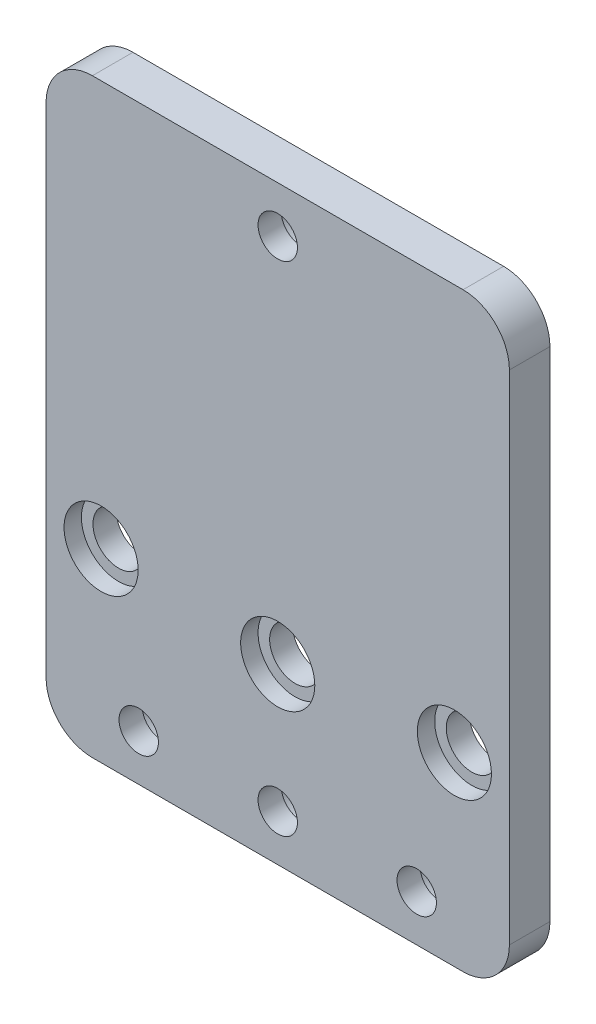
ISO-10303-21;
HEADER;
FILE_DESCRIPTION(('STEP AP214'),'2;1');
FILE_NAME('part.step','',(''),(''),'','','');
FILE_SCHEMA(('AUTOMOTIVE_DESIGN { 1 0 10303 214 1 1 1 1 }'));
ENDSEC;
DATA;
#1=APPLICATION_CONTEXT('core data for automotive mechanical design processes');
#2=APPLICATION_PROTOCOL_DEFINITION('international standard','automotive_design',2000,#1);
#3=PRODUCT_CONTEXT('',#1,'mechanical');
#4=PRODUCT('Part','Part','',(#3));
#5=PRODUCT_RELATED_PRODUCT_CATEGORY('part','',(#4));
#6=PRODUCT_DEFINITION_FORMATION('','',#4);
#7=PRODUCT_DEFINITION_CONTEXT('part definition',#1,'design');
#8=PRODUCT_DEFINITION('design','',#6,#7);
#9=PRODUCT_DEFINITION_SHAPE('','',#8);
#10=(LENGTH_UNIT() NAMED_UNIT(*) SI_UNIT(.MILLI.,.METRE.));
#11=(NAMED_UNIT(*) PLANE_ANGLE_UNIT() SI_UNIT($,.RADIAN.));
#12=(NAMED_UNIT(*) SI_UNIT($,.STERADIAN.) SOLID_ANGLE_UNIT());
#13=UNCERTAINTY_MEASURE_WITH_UNIT(LENGTH_MEASURE(1.E-05),#10,'distance_accuracy_value','');
#14=(GEOMETRIC_REPRESENTATION_CONTEXT(3) GLOBAL_UNCERTAINTY_ASSIGNED_CONTEXT((#13)) GLOBAL_UNIT_ASSIGNED_CONTEXT((#10,
#11,#12)) REPRESENTATION_CONTEXT('',''));
#15=CARTESIAN_POINT('',(0.,0.,0.));
#16=DIRECTION('',(0.,0.,1.));
#17=DIRECTION('',(1.,0.,0.));
#18=AXIS2_PLACEMENT_3D('',#15,#16,#17);
#19=CARTESIAN_POINT('',(8236.96943647304,3040.35410162317,3.5));
#20=DIRECTION('',(0.,0.,-1.));
#21=DIRECTION('',(-1.,0.,0.));
#22=AXIS2_PLACEMENT_3D('',#19,#20,#21);
#23=CYLINDRICAL_SURFACE('',#22,1.69999999999968);
#24=CARTESIAN_POINT('',(8236.96943647304,3040.35410162317,3.5));
#25=DIRECTION('',(0.,0.,1.));
#26=DIRECTION('',(1.,0.,0.));
#27=AXIS2_PLACEMENT_3D('',#24,#25,#26);
#28=CIRCLE('',#27,1.69999999999968);
#29=CARTESIAN_POINT('',(8238.66943647304,3040.35410162317,3.5));
#30=VERTEX_POINT('',#29);
#31=EDGE_CURVE('E159',#30,#30,#28,.T.);
#32=ORIENTED_EDGE('',*,*,#31,.T.);
#33=EDGE_LOOP('',(#32));
#34=FACE_BOUND('',#33,.T.);
#35=CARTESIAN_POINT('',(8236.96943647304,3040.35410162317,1.5));
#36=DIRECTION('',(0.,0.,-1.));
#37=DIRECTION('',(-1.,0.,0.));
#38=AXIS2_PLACEMENT_3D('',#35,#36,#37);
#39=CIRCLE('',#38,1.69999999999968);
#40=CARTESIAN_POINT('',(8235.26943647304,3040.35410162317,1.5));
#41=VERTEX_POINT('',#40);
#42=EDGE_CURVE('E53',#41,#41,#39,.T.);
#43=ORIENTED_EDGE('',*,*,#42,.T.);
#44=EDGE_LOOP('',(#43));
#45=FACE_BOUND('',#44,.T.);
#46=ADVANCED_FACE('F49',(#34,#45),#23,.F.);
#47=CARTESIAN_POINT('',(8248.96943647229,2997.36627584749,3.5));
#48=DIRECTION('',(0.,0.,-1.));
#49=DIRECTION('',(-1.,0.,0.));
#50=AXIS2_PLACEMENT_3D('',#47,#48,#49);
#51=CYLINDRICAL_SURFACE('',#50,1.69999999999968);
#52=CARTESIAN_POINT('',(8248.96943647229,2997.36627584749,3.5));
#53=DIRECTION('',(0.,0.,1.));
#54=DIRECTION('',(1.,0.,0.));
#55=AXIS2_PLACEMENT_3D('',#52,#53,#54);
#56=CIRCLE('',#55,1.69999999999968);
#57=CARTESIAN_POINT('',(8250.66943647229,2997.36627584749,3.5));
#58=VERTEX_POINT('',#57);
#59=EDGE_CURVE('E250',#58,#58,#56,.T.);
#60=ORIENTED_EDGE('',*,*,#59,.T.);
#61=EDGE_LOOP('',(#60));
#62=FACE_BOUND('',#61,.T.);
#63=CARTESIAN_POINT('',(8248.96943647229,2997.36627584749,1.5));
#64=DIRECTION('',(0.,0.,-1.));
#65=DIRECTION('',(-1.,0.,0.));
#66=AXIS2_PLACEMENT_3D('',#63,#64,#65);
#67=CIRCLE('',#66,1.69999999999968);
#68=CARTESIAN_POINT('',(8247.26943647229,2997.36627584749,1.5));
#69=VERTEX_POINT('',#68);
#70=EDGE_CURVE('E215',#69,#69,#67,.T.);
#71=ORIENTED_EDGE('',*,*,#70,.T.);
#72=EDGE_LOOP('',(#71));
#73=FACE_BOUND('',#72,.T.);
#74=ADVANCED_FACE('F300',(#62,#73),#51,.F.);
#75=CARTESIAN_POINT('',(8236.96943647229,2997.36627584749,3.5));
#76=DIRECTION('',(0.,0.,-1.));
#77=DIRECTION('',(-1.,0.,0.));
#78=AXIS2_PLACEMENT_3D('',#75,#76,#77);
#79=CYLINDRICAL_SURFACE('',#78,1.69999999999968);
#80=CARTESIAN_POINT('',(8236.96943647229,2997.36627584749,3.5));
#81=DIRECTION('',(0.,0.,1.));
#82=DIRECTION('',(1.,0.,0.));
#83=AXIS2_PLACEMENT_3D('',#80,#81,#82);
#84=CIRCLE('',#83,1.69999999999968);
#85=CARTESIAN_POINT('',(8238.66943647229,2997.36627584749,3.5));
#86=VERTEX_POINT('',#85);
#87=EDGE_CURVE('E246',#86,#86,#84,.T.);
#88=ORIENTED_EDGE('',*,*,#87,.T.);
#89=EDGE_LOOP('',(#88));
#90=FACE_BOUND('',#89,.T.);
#91=CARTESIAN_POINT('',(8236.96943647229,2997.36627584749,1.5));
#92=DIRECTION('',(0.,0.,-1.));
#93=DIRECTION('',(-1.,0.,0.));
#94=AXIS2_PLACEMENT_3D('',#91,#92,#93);
#95=CIRCLE('',#94,1.69999999999968);
#96=CARTESIAN_POINT('',(8235.26943647229,2997.36627584749,1.5));
#97=VERTEX_POINT('',#96);
#98=EDGE_CURVE('E212',#97,#97,#95,.T.);
#99=ORIENTED_EDGE('',*,*,#98,.T.);
#100=EDGE_LOOP('',(#99));
#101=FACE_BOUND('',#100,.T.);
#102=ADVANCED_FACE('F305',(#90,#101),#79,.F.);
#103=CARTESIAN_POINT('',(8224.96943647229,2997.36627584749,3.5));
#104=DIRECTION('',(0.,0.,-1.));
#105=DIRECTION('',(-1.,0.,0.));
#106=AXIS2_PLACEMENT_3D('',#103,#104,#105);
#107=CYLINDRICAL_SURFACE('',#106,1.69999999999968);
#108=CARTESIAN_POINT('',(8224.96943647229,2997.36627584749,3.5));
#109=DIRECTION('',(0.,0.,1.));
#110=DIRECTION('',(1.,0.,0.));
#111=AXIS2_PLACEMENT_3D('',#108,#109,#110);
#112=CIRCLE('',#111,1.69999999999968);
#113=CARTESIAN_POINT('',(8226.66943647229,2997.36627584749,3.5));
#114=VERTEX_POINT('',#113);
#115=EDGE_CURVE('E242',#114,#114,#112,.T.);
#116=ORIENTED_EDGE('',*,*,#115,.T.);
#117=EDGE_LOOP('',(#116));
#118=FACE_BOUND('',#117,.T.);
#119=CARTESIAN_POINT('',(8224.96943647229,2997.36627584749,1.5));
#120=DIRECTION('',(0.,0.,-1.));
#121=DIRECTION('',(-1.,0.,0.));
#122=AXIS2_PLACEMENT_3D('',#119,#120,#121);
#123=CIRCLE('',#122,1.69999999999968);
#124=CARTESIAN_POINT('',(8223.26943647229,2997.36627584749,1.5));
#125=VERTEX_POINT('',#124);
#126=EDGE_CURVE('E208',#125,#125,#123,.T.);
#127=ORIENTED_EDGE('',*,*,#126,.T.);
#128=EDGE_LOOP('',(#127));
#129=FACE_BOUND('',#128,.T.);
#130=ADVANCED_FACE('F385',(#118,#129),#107,.F.);
#131=CARTESIAN_POINT('',(8236.96943647304,3008.36627584749,3.5));
#132=DIRECTION('',(0.,0.,-1.));
#133=DIRECTION('',(-1.,0.,0.));
#134=AXIS2_PLACEMENT_3D('',#131,#132,#133);
#135=CYLINDRICAL_SURFACE('',#134,2.19999999999973);
#136=CARTESIAN_POINT('',(8236.96943647304,3008.36627584749,0.));
#137=DIRECTION('',(0.,0.,1.));
#138=DIRECTION('',(1.,0.,0.));
#139=AXIS2_PLACEMENT_3D('',#136,#137,#138);
#140=CIRCLE('',#139,2.19999999999973);
#141=CARTESIAN_POINT('',(8239.16943647304,3008.36627584749,0.));
#142=VERTEX_POINT('',#141);
#143=EDGE_CURVE('E233',#142,#142,#140,.T.);
#144=ORIENTED_EDGE('',*,*,#143,.F.);
#145=EDGE_LOOP('',(#144));
#146=FACE_BOUND('',#145,.T.);
#147=CARTESIAN_POINT('',(8236.96943647304,3008.36627584749,2.));
#148=DIRECTION('',(0.,0.,1.));
#149=DIRECTION('',(1.,0.,0.));
#150=AXIS2_PLACEMENT_3D('',#147,#148,#149);
#151=CIRCLE('',#150,2.19999999999973);
#152=CARTESIAN_POINT('',(8239.16943647304,3008.36627584749,2.));
#153=VERTEX_POINT('',#152);
#154=EDGE_CURVE('E204',#153,#153,#151,.T.);
#155=ORIENTED_EDGE('',*,*,#154,.T.);
#156=EDGE_LOOP('',(#155));
#157=FACE_BOUND('',#156,.T.);
#158=ADVANCED_FACE('F388',(#146,#157),#135,.F.);
#159=CARTESIAN_POINT('',(8221.71943647304,3009.36627584749,3.5));
#160=DIRECTION('',(0.,0.,-1.));
#161=DIRECTION('',(-1.,0.,0.));
#162=AXIS2_PLACEMENT_3D('',#159,#160,#161);
#163=CYLINDRICAL_SURFACE('',#162,2.19999999999973);
#164=CARTESIAN_POINT('',(8221.71943647304,3009.36627584749,0.));
#165=DIRECTION('',(0.,0.,1.));
#166=DIRECTION('',(1.,0.,0.));
#167=AXIS2_PLACEMENT_3D('',#164,#165,#166);
#168=CIRCLE('',#167,2.19999999999973);
#169=CARTESIAN_POINT('',(8223.91943647304,3009.36627584749,0.));
#170=VERTEX_POINT('',#169);
#171=EDGE_CURVE('E227',#170,#170,#168,.T.);
#172=ORIENTED_EDGE('',*,*,#171,.F.);
#173=EDGE_LOOP('',(#172));
#174=FACE_BOUND('',#173,.T.);
#175=CARTESIAN_POINT('',(8221.71943647304,3009.36627584749,2.));
#176=DIRECTION('',(0.,0.,1.));
#177=DIRECTION('',(1.,0.,0.));
#178=AXIS2_PLACEMENT_3D('',#175,#176,#177);
#179=CIRCLE('',#178,2.19999999999973);
#180=CARTESIAN_POINT('',(8223.91943647304,3009.36627584749,2.));
#181=VERTEX_POINT('',#180);
#182=EDGE_CURVE('E199',#181,#181,#179,.T.);
#183=ORIENTED_EDGE('',*,*,#182,.T.);
#184=EDGE_LOOP('',(#183));
#185=FACE_BOUND('',#184,.T.);
#186=ADVANCED_FACE('F425',(#174,#185),#163,.F.);
#187=CARTESIAN_POINT('',(8252.21943647304,3009.36627584749,3.5));
#188=DIRECTION('',(0.,0.,-1.));
#189=DIRECTION('',(-1.,0.,0.));
#190=AXIS2_PLACEMENT_3D('',#187,#188,#189);
#191=CYLINDRICAL_SURFACE('',#190,2.19999999999973);
#192=CARTESIAN_POINT('',(8252.21943647304,3009.36627584749,0.));
#193=DIRECTION('',(0.,0.,1.));
#194=DIRECTION('',(1.,0.,0.));
#195=AXIS2_PLACEMENT_3D('',#192,#193,#194);
#196=CIRCLE('',#195,2.19999999999973);
#197=CARTESIAN_POINT('',(8254.41943647304,3009.36627584749,0.));
#198=VERTEX_POINT('',#197);
#199=EDGE_CURVE('E222',#198,#198,#196,.T.);
#200=ORIENTED_EDGE('',*,*,#199,.F.);
#201=EDGE_LOOP('',(#200));
#202=FACE_BOUND('',#201,.T.);
#203=CARTESIAN_POINT('',(8252.21943647304,3009.36627584749,2.));
#204=DIRECTION('',(0.,0.,1.));
#205=DIRECTION('',(1.,0.,0.));
#206=AXIS2_PLACEMENT_3D('',#203,#204,#205);
#207=CIRCLE('',#206,2.19999999999973);
#208=CARTESIAN_POINT('',(8254.41943647304,3009.36627584749,2.));
#209=VERTEX_POINT('',#208);
#210=EDGE_CURVE('E195',#209,#209,#207,.T.);
#211=ORIENTED_EDGE('',*,*,#210,.T.);
#212=EDGE_LOOP('',(#211));
#213=FACE_BOUND('',#212,.T.);
#214=ADVANCED_FACE('F311',(#202,#213),#191,.F.);
#215=CARTESIAN_POINT('',(8252.96943647229,2997.36627584749,3.5));
#216=DIRECTION('',(0.,0.,1.));
#217=DIRECTION('',(1.,0.,0.));
#218=AXIS2_PLACEMENT_3D('',#215,#216,#217);
#219=PLANE('',#218);
#220=CARTESIAN_POINT('',(8252.21943647304,3009.36627584749,3.5));
#221=DIRECTION('',(0.,0.,1.));
#222=DIRECTION('',(1.,0.,0.));
#223=AXIS2_PLACEMENT_3D('',#220,#221,#222);
#224=CIRCLE('',#223,3.19999999999985);
#225=CARTESIAN_POINT('',(8255.41943647304,3009.36627584749,3.5));
#226=VERTEX_POINT('',#225);
#227=EDGE_CURVE('E343',#226,#226,#224,.T.);
#228=ORIENTED_EDGE('',*,*,#227,.F.);
#229=EDGE_LOOP('',(#228));
#230=FACE_BOUND('',#229,.T.);
#231=CARTESIAN_POINT('',(8221.71943647304,3009.36627584749,3.5));
#232=DIRECTION('',(0.,0.,1.));
#233=DIRECTION('',(1.,0.,0.));
#234=AXIS2_PLACEMENT_3D('',#231,#232,#233);
#235=CIRCLE('',#234,3.19999999999985);
#236=CARTESIAN_POINT('',(8224.91943647304,3009.36627584749,3.5));
#237=VERTEX_POINT('',#236);
#238=EDGE_CURVE('E351',#237,#237,#235,.T.);
#239=ORIENTED_EDGE('',*,*,#238,.F.);
#240=EDGE_LOOP('',(#239));
#241=FACE_BOUND('',#240,.T.);
#242=CARTESIAN_POINT('',(8236.96943647304,3008.36627584749,3.5));
#243=DIRECTION('',(0.,0.,1.));
#244=DIRECTION('',(1.,0.,0.));
#245=AXIS2_PLACEMENT_3D('',#242,#243,#244);
#246=CIRCLE('',#245,3.19999999999985);
#247=CARTESIAN_POINT('',(8240.16943647304,3008.36627584749,3.5));
#248=VERTEX_POINT('',#247);
#249=EDGE_CURVE('E236',#248,#248,#246,.T.);
#250=ORIENTED_EDGE('',*,*,#249,.F.);
#251=EDGE_LOOP('',(#250));
#252=FACE_BOUND('',#251,.T.);
#253=ORIENTED_EDGE('',*,*,#115,.F.);
#254=EDGE_LOOP('',(#253));
#255=FACE_BOUND('',#254,.T.);
#256=ORIENTED_EDGE('',*,*,#59,.F.);
#257=EDGE_LOOP('',(#256));
#258=FACE_BOUND('',#257,.T.);
#259=CARTESIAN_POINT('',(8252.96943647229,2997.36627584749,3.5));
#260=DIRECTION('',(0.,0.,1.));
#261=DIRECTION('',(1.,0.,0.));
#262=AXIS2_PLACEMENT_3D('',#259,#260,#261);
#263=CIRCLE('',#262,3.99999999999978);
#264=CARTESIAN_POINT('',(8252.96943647229,2993.36627584749,3.5));
#265=VERTEX_POINT('',#264);
#266=CARTESIAN_POINT('',(8256.96943647229,2997.36627584749,3.5));
#267=VERTEX_POINT('',#266);
#268=EDGE_CURVE('E177',#265,#267,#263,.T.);
#269=ORIENTED_EDGE('',*,*,#268,.T.);
#270=DIRECTION('',(0.,1.,0.));
#271=VECTOR('',#270,1.);
#272=CARTESIAN_POINT('',(8256.96943647229,3040.35410162317,3.5));
#273=LINE('',#272,#271);
#274=CARTESIAN_POINT('',(8256.96943647229,3040.35410162317,3.5));
#275=VERTEX_POINT('',#274);
#276=EDGE_CURVE('E112',#267,#275,#273,.T.);
#277=ORIENTED_EDGE('',*,*,#276,.T.);
#278=CARTESIAN_POINT('',(8252.96943647229,3040.35410162317,3.5));
#279=DIRECTION('',(0.,0.,1.));
#280=DIRECTION('',(-1.,0.,0.));
#281=AXIS2_PLACEMENT_3D('',#278,#279,#280);
#282=CIRCLE('',#281,3.99999999999978);
#283=CARTESIAN_POINT('',(8252.96943647229,3044.35410162317,3.5));
#284=VERTEX_POINT('',#283);
#285=EDGE_CURVE('E261',#275,#284,#282,.T.);
#286=ORIENTED_EDGE('',*,*,#285,.T.);
#287=DIRECTION('',(-1.,0.,0.));
#288=VECTOR('',#287,1.);
#289=CARTESIAN_POINT('',(8220.96943647229,3044.35410162317,3.5));
#290=LINE('',#289,#288);
#291=CARTESIAN_POINT('',(8220.96943647229,3044.35410162317,3.5));
#292=VERTEX_POINT('',#291);
#293=EDGE_CURVE('E264',#284,#292,#290,.T.);
#294=ORIENTED_EDGE('',*,*,#293,.T.);
#295=CARTESIAN_POINT('',(8220.96943647229,3040.35410162317,3.5));
#296=DIRECTION('',(0.,0.,1.));
#297=DIRECTION('',(1.,0.,0.));
#298=AXIS2_PLACEMENT_3D('',#295,#296,#297);
#299=CIRCLE('',#298,3.99999999999978);
#300=CARTESIAN_POINT('',(8216.96943647229,3040.35410162317,3.5));
#301=VERTEX_POINT('',#300);
#302=EDGE_CURVE('E132',#292,#301,#299,.T.);
#303=ORIENTED_EDGE('',*,*,#302,.T.);
#304=DIRECTION('',(0.,-1.,0.));
#305=VECTOR('',#304,1.);
#306=CARTESIAN_POINT('',(8216.96943647229,3040.35410162317,3.5));
#307=LINE('',#306,#305);
#308=CARTESIAN_POINT('',(8216.96943647229,2997.36627584749,3.5));
#309=VERTEX_POINT('',#308);
#310=EDGE_CURVE('E125',#301,#309,#307,.T.);
#311=ORIENTED_EDGE('',*,*,#310,.T.);
#312=CARTESIAN_POINT('',(8220.96943647229,2997.36627584749,3.5));
#313=DIRECTION('',(0.,0.,1.));
#314=DIRECTION('',(1.,0.,0.));
#315=AXIS2_PLACEMENT_3D('',#312,#313,#314);
#316=CIRCLE('',#315,3.99999999999978);
#317=CARTESIAN_POINT('',(8220.96943647229,2993.36627584749,3.5));
#318=VERTEX_POINT('',#317);
#319=EDGE_CURVE('E130',#309,#318,#316,.T.);
#320=ORIENTED_EDGE('',*,*,#319,.T.);
#321=DIRECTION('',(1.,0.,0.));
#322=VECTOR('',#321,1.);
#323=CARTESIAN_POINT('',(8220.96943647229,2993.36627584749,3.5));
#324=LINE('',#323,#322);
#325=EDGE_CURVE('E69',#318,#265,#324,.T.);
#326=ORIENTED_EDGE('',*,*,#325,.T.);
#327=EDGE_LOOP('',(#269,#277,#286,#294,#303,#311,#320,#326));
#328=FACE_BOUND('',#327,.T.);
#329=ORIENTED_EDGE('',*,*,#31,.F.);
#330=EDGE_LOOP('',(#329));
#331=FACE_BOUND('',#330,.T.);
#332=ORIENTED_EDGE('',*,*,#87,.F.);
#333=EDGE_LOOP('',(#332));
#334=FACE_BOUND('',#333,.T.);
#335=ADVANCED_FACE('F127',(#230,#241,#252,#255,#258,#328,#331,#334),#219,.T.);
#336=CARTESIAN_POINT('',(8252.96943647229,2997.36627584749,0.));
#337=DIRECTION('',(0.,0.,1.));
#338=DIRECTION('',(1.,0.,0.));
#339=AXIS2_PLACEMENT_3D('',#336,#337,#338);
#340=PLANE('',#339);
#341=CARTESIAN_POINT('',(8224.96943647229,2997.36627584749,0.));
#342=DIRECTION('',(0.,0.,-1.));
#343=DIRECTION('',(-1.,0.,0.));
#344=AXIS2_PLACEMENT_3D('',#341,#342,#343);
#345=CIRCLE('',#344,2.70000000000162);
#346=CARTESIAN_POINT('',(8222.26943647229,2997.36627584749,0.));
#347=VERTEX_POINT('',#346);
#348=EDGE_CURVE('E321',#347,#347,#345,.T.);
#349=ORIENTED_EDGE('',*,*,#348,.F.);
#350=EDGE_LOOP('',(#349));
#351=FACE_BOUND('',#350,.T.);
#352=CARTESIAN_POINT('',(8236.96943647229,2997.36627584749,0.));
#353=DIRECTION('',(0.,0.,-1.));
#354=DIRECTION('',(-1.,0.,0.));
#355=AXIS2_PLACEMENT_3D('',#352,#353,#354);
#356=CIRCLE('',#355,2.70000000000162);
#357=CARTESIAN_POINT('',(8234.26943647229,2997.36627584749,0.));
#358=VERTEX_POINT('',#357);
#359=EDGE_CURVE('E325',#358,#358,#356,.T.);
#360=ORIENTED_EDGE('',*,*,#359,.F.);
#361=EDGE_LOOP('',(#360));
#362=FACE_BOUND('',#361,.T.);
#363=CARTESIAN_POINT('',(8248.96943647229,2997.36627584749,0.));
#364=DIRECTION('',(0.,0.,-1.));
#365=DIRECTION('',(-1.,0.,0.));
#366=AXIS2_PLACEMENT_3D('',#363,#364,#365);
#367=CIRCLE('',#366,2.70000000000162);
#368=CARTESIAN_POINT('',(8246.26943647229,2997.36627584749,0.));
#369=VERTEX_POINT('',#368);
#370=EDGE_CURVE('E329',#369,#369,#367,.T.);
#371=ORIENTED_EDGE('',*,*,#370,.F.);
#372=EDGE_LOOP('',(#371));
#373=FACE_BOUND('',#372,.T.);
#374=CARTESIAN_POINT('',(8236.96943647304,3040.35410162317,0.));
#375=DIRECTION('',(0.,0.,-1.));
#376=DIRECTION('',(-1.,0.,0.));
#377=AXIS2_PLACEMENT_3D('',#374,#375,#376);
#378=CIRCLE('',#377,2.70000000000162);
#379=CARTESIAN_POINT('',(8234.26943647304,3040.35410162317,0.));
#380=VERTEX_POINT('',#379);
#381=EDGE_CURVE('E332',#380,#380,#378,.T.);
#382=ORIENTED_EDGE('',*,*,#381,.F.);
#383=EDGE_LOOP('',(#382));
#384=FACE_BOUND('',#383,.T.);
#385=CARTESIAN_POINT('',(8252.96943647229,2997.36627584749,0.));
#386=DIRECTION('',(0.,0.,1.));
#387=DIRECTION('',(1.,0.,0.));
#388=AXIS2_PLACEMENT_3D('',#385,#386,#387);
#389=CIRCLE('',#388,3.99999999999978);
#390=CARTESIAN_POINT('',(8252.96943647229,2993.36627584749,0.));
#391=VERTEX_POINT('',#390);
#392=CARTESIAN_POINT('',(8256.96943647229,2997.36627584749,0.));
#393=VERTEX_POINT('',#392);
#394=EDGE_CURVE('E154',#391,#393,#389,.T.);
#395=ORIENTED_EDGE('',*,*,#394,.F.);
#396=DIRECTION('',(1.,0.,0.));
#397=VECTOR('',#396,1.);
#398=CARTESIAN_POINT('',(8220.96943647229,2993.36627584749,0.));
#399=LINE('',#398,#397);
#400=CARTESIAN_POINT('',(8220.96943647229,2993.36627584749,0.));
#401=VERTEX_POINT('',#400);
#402=EDGE_CURVE('E104',#401,#391,#399,.T.);
#403=ORIENTED_EDGE('',*,*,#402,.F.);
#404=CARTESIAN_POINT('',(8220.96943647229,2997.36627584749,0.));
#405=DIRECTION('',(0.,0.,1.));
#406=DIRECTION('',(1.,0.,0.));
#407=AXIS2_PLACEMENT_3D('',#404,#405,#406);
#408=CIRCLE('',#407,3.99999999999978);
#409=CARTESIAN_POINT('',(8216.96943647229,2997.36627584749,0.));
#410=VERTEX_POINT('',#409);
#411=EDGE_CURVE('E98',#410,#401,#408,.T.);
#412=ORIENTED_EDGE('',*,*,#411,.F.);
#413=DIRECTION('',(0.,-1.,0.));
#414=VECTOR('',#413,1.);
#415=CARTESIAN_POINT('',(8216.96943647229,3040.35410162317,0.));
#416=LINE('',#415,#414);
#417=CARTESIAN_POINT('',(8216.96943647229,3040.35410162317,0.));
#418=VERTEX_POINT('',#417);
#419=EDGE_CURVE('E141',#418,#410,#416,.T.);
#420=ORIENTED_EDGE('',*,*,#419,.F.);
#421=CARTESIAN_POINT('',(8220.96943647229,3040.35410162317,0.));
#422=DIRECTION('',(0.,0.,1.));
#423=DIRECTION('',(1.,0.,0.));
#424=AXIS2_PLACEMENT_3D('',#421,#422,#423);
#425=CIRCLE('',#424,3.99999999999978);
#426=CARTESIAN_POINT('',(8220.96943647229,3044.35410162317,0.));
#427=VERTEX_POINT('',#426);
#428=EDGE_CURVE('E168',#427,#418,#425,.T.);
#429=ORIENTED_EDGE('',*,*,#428,.F.);
#430=DIRECTION('',(-1.,0.,0.));
#431=VECTOR('',#430,1.);
#432=CARTESIAN_POINT('',(8220.96943647229,3044.35410162317,0.));
#433=LINE('',#432,#431);
#434=CARTESIAN_POINT('',(8252.96943647229,3044.35410162317,0.));
#435=VERTEX_POINT('',#434);
#436=EDGE_CURVE('E165',#435,#427,#433,.T.);
#437=ORIENTED_EDGE('',*,*,#436,.F.);
#438=CARTESIAN_POINT('',(8252.96943647229,3040.35410162317,0.));
#439=DIRECTION('',(0.,0.,1.));
#440=DIRECTION('',(-1.,0.,0.));
#441=AXIS2_PLACEMENT_3D('',#438,#439,#440);
#442=CIRCLE('',#441,3.99999999999978);
#443=CARTESIAN_POINT('',(8256.96943647229,3040.35410162317,0.));
#444=VERTEX_POINT('',#443);
#445=EDGE_CURVE('E162',#444,#435,#442,.T.);
#446=ORIENTED_EDGE('',*,*,#445,.F.);
#447=DIRECTION('',(0.,1.,0.));
#448=VECTOR('',#447,1.);
#449=CARTESIAN_POINT('',(8256.96943647229,3040.35410162317,0.));
#450=LINE('',#449,#448);
#451=EDGE_CURVE('E158',#393,#444,#450,.T.);
#452=ORIENTED_EDGE('',*,*,#451,.F.);
#453=EDGE_LOOP('',(#395,#403,#412,#420,#429,#437,#446,#452));
#454=FACE_BOUND('',#453,.T.);
#455=ORIENTED_EDGE('',*,*,#143,.T.);
#456=EDGE_LOOP('',(#455));
#457=FACE_BOUND('',#456,.T.);
#458=ORIENTED_EDGE('',*,*,#171,.T.);
#459=EDGE_LOOP('',(#458));
#460=FACE_BOUND('',#459,.T.);
#461=ORIENTED_EDGE('',*,*,#199,.T.);
#462=EDGE_LOOP('',(#461));
#463=FACE_BOUND('',#462,.T.);
#464=ADVANCED_FACE('F279',(#351,#362,#373,#384,#454,#457,#460,#463),#340,.F.);
#465=CARTESIAN_POINT('',(8252.96943647229,2997.36627584749,3.5));
#466=DIRECTION('',(0.,0.,-1.));
#467=DIRECTION('',(-1.,0.,0.));
#468=AXIS2_PLACEMENT_3D('',#465,#466,#467);
#469=CYLINDRICAL_SURFACE('',#468,3.99999999999978);
#470=ORIENTED_EDGE('',*,*,#394,.T.);
#471=DIRECTION('',(0.,0.,-1.));
#472=VECTOR('',#471,1.);
#473=CARTESIAN_POINT('',(8256.96943647229,2997.36627584749,3.5));
#474=LINE('',#473,#472);
#475=EDGE_CURVE('E11',#267,#393,#474,.T.);
#476=ORIENTED_EDGE('',*,*,#475,.F.);
#477=ORIENTED_EDGE('',*,*,#268,.F.);
#478=DIRECTION('',(0.,0.,-1.));
#479=VECTOR('',#478,1.);
#480=CARTESIAN_POINT('',(8252.96943647229,2993.36627584749,3.5));
#481=LINE('',#480,#479);
#482=EDGE_CURVE('E150',#265,#391,#481,.T.);
#483=ORIENTED_EDGE('',*,*,#482,.T.);
#484=EDGE_LOOP('',(#470,#476,#477,#483));
#485=FACE_BOUND('',#484,.T.);
#486=ADVANCED_FACE('F51',(#485),#469,.T.);
#487=CARTESIAN_POINT('',(8256.96943647229,3040.35410162317,3.5));
#488=DIRECTION('',(-1.,0.,0.));
#489=DIRECTION('',(0.,0.,1.));
#490=AXIS2_PLACEMENT_3D('',#487,#488,#489);
#491=PLANE('',#490);
#492=ORIENTED_EDGE('',*,*,#451,.T.);
#493=DIRECTION('',(0.,0.,-1.));
#494=VECTOR('',#493,1.);
#495=CARTESIAN_POINT('',(8256.96943647229,3040.35410162317,3.5));
#496=LINE('',#495,#494);
#497=EDGE_CURVE('E60',#275,#444,#496,.T.);
#498=ORIENTED_EDGE('',*,*,#497,.F.);
#499=ORIENTED_EDGE('',*,*,#276,.F.);
#500=ORIENTED_EDGE('',*,*,#475,.T.);
#501=EDGE_LOOP('',(#492,#498,#499,#500));
#502=FACE_BOUND('',#501,.T.);
#503=ADVANCED_FACE('F317',(#502),#491,.F.);
#504=CARTESIAN_POINT('',(8252.96943647229,3040.35410162317,3.5));
#505=DIRECTION('',(0.,0.,-1.));
#506=DIRECTION('',(-1.,0.,0.));
#507=AXIS2_PLACEMENT_3D('',#504,#505,#506);
#508=CYLINDRICAL_SURFACE('',#507,3.99999999999978);
#509=ORIENTED_EDGE('',*,*,#445,.T.);
#510=DIRECTION('',(0.,0.,-1.));
#511=VECTOR('',#510,1.);
#512=CARTESIAN_POINT('',(8252.96943647229,3044.35410162317,3.5));
#513=LINE('',#512,#511);
#514=EDGE_CURVE('E188',#284,#435,#513,.T.);
#515=ORIENTED_EDGE('',*,*,#514,.F.);
#516=ORIENTED_EDGE('',*,*,#285,.F.);
#517=ORIENTED_EDGE('',*,*,#497,.T.);
#518=EDGE_LOOP('',(#509,#515,#516,#517));
#519=FACE_BOUND('',#518,.T.);
#520=ADVANCED_FACE('F624',(#519),#508,.T.);
#521=CARTESIAN_POINT('',(8220.96943647229,3044.35410162317,3.5));
#522=DIRECTION('',(0.,-1.,0.));
#523=DIRECTION('',(0.,0.,-1.));
#524=AXIS2_PLACEMENT_3D('',#521,#522,#523);
#525=PLANE('',#524);
#526=ORIENTED_EDGE('',*,*,#436,.T.);
#527=DIRECTION('',(0.,0.,-1.));
#528=VECTOR('',#527,1.);
#529=CARTESIAN_POINT('',(8220.96943647229,3044.35410162317,3.5));
#530=LINE('',#529,#528);
#531=EDGE_CURVE('E184',#292,#427,#530,.T.);
#532=ORIENTED_EDGE('',*,*,#531,.F.);
#533=ORIENTED_EDGE('',*,*,#293,.F.);
#534=ORIENTED_EDGE('',*,*,#514,.T.);
#535=EDGE_LOOP('',(#526,#532,#533,#534));
#536=FACE_BOUND('',#535,.T.);
#537=ADVANCED_FACE('F272',(#536),#525,.F.);
#538=CARTESIAN_POINT('',(8220.96943647229,3040.35410162317,3.5));
#539=DIRECTION('',(0.,0.,-1.));
#540=DIRECTION('',(-1.,0.,0.));
#541=AXIS2_PLACEMENT_3D('',#538,#539,#540);
#542=CYLINDRICAL_SURFACE('',#541,3.99999999999978);
#543=ORIENTED_EDGE('',*,*,#428,.T.);
#544=DIRECTION('',(0.,0.,-1.));
#545=VECTOR('',#544,1.);
#546=CARTESIAN_POINT('',(8216.96943647229,3040.35410162317,3.5));
#547=LINE('',#546,#545);
#548=EDGE_CURVE('E143',#301,#418,#547,.T.);
#549=ORIENTED_EDGE('',*,*,#548,.F.);
#550=ORIENTED_EDGE('',*,*,#302,.F.);
#551=ORIENTED_EDGE('',*,*,#531,.T.);
#552=EDGE_LOOP('',(#543,#549,#550,#551));
#553=FACE_BOUND('',#552,.T.);
#554=ADVANCED_FACE('F276',(#553),#542,.T.);
#555=CARTESIAN_POINT('',(8216.96943647229,3040.35410162317,3.5));
#556=DIRECTION('',(1.,0.,0.));
#557=DIRECTION('',(0.,0.,-1.));
#558=AXIS2_PLACEMENT_3D('',#555,#556,#557);
#559=PLANE('',#558);
#560=ORIENTED_EDGE('',*,*,#419,.T.);
#561=DIRECTION('',(0.,0.,-1.));
#562=VECTOR('',#561,1.);
#563=CARTESIAN_POINT('',(8216.96943647229,2997.36627584749,3.5));
#564=LINE('',#563,#562);
#565=EDGE_CURVE('E138',#309,#410,#564,.T.);
#566=ORIENTED_EDGE('',*,*,#565,.F.);
#567=ORIENTED_EDGE('',*,*,#310,.F.);
#568=ORIENTED_EDGE('',*,*,#548,.T.);
#569=EDGE_LOOP('',(#560,#566,#567,#568));
#570=FACE_BOUND('',#569,.T.);
#571=ADVANCED_FACE('F139',(#570),#559,.F.);
#572=CARTESIAN_POINT('',(8220.96943647229,2997.36627584749,3.5));
#573=DIRECTION('',(0.,0.,-1.));
#574=DIRECTION('',(-1.,0.,0.));
#575=AXIS2_PLACEMENT_3D('',#572,#573,#574);
#576=CYLINDRICAL_SURFACE('',#575,3.99999999999978);
#577=ORIENTED_EDGE('',*,*,#411,.T.);
#578=DIRECTION('',(0.,0.,-1.));
#579=VECTOR('',#578,1.);
#580=CARTESIAN_POINT('',(8220.96943647229,2993.36627584749,3.5));
#581=LINE('',#580,#579);
#582=EDGE_CURVE('E144',#318,#401,#581,.T.);
#583=ORIENTED_EDGE('',*,*,#582,.F.);
#584=ORIENTED_EDGE('',*,*,#319,.F.);
#585=ORIENTED_EDGE('',*,*,#565,.T.);
#586=EDGE_LOOP('',(#577,#583,#584,#585));
#587=FACE_BOUND('',#586,.T.);
#588=ADVANCED_FACE('F146',(#587),#576,.T.);
#589=CARTESIAN_POINT('',(8220.96943647229,2993.36627584749,3.5));
#590=DIRECTION('',(0.,1.,0.));
#591=DIRECTION('',(0.,0.,1.));
#592=AXIS2_PLACEMENT_3D('',#589,#590,#591);
#593=PLANE('',#592);
#594=ORIENTED_EDGE('',*,*,#402,.T.);
#595=ORIENTED_EDGE('',*,*,#482,.F.);
#596=ORIENTED_EDGE('',*,*,#325,.F.);
#597=ORIENTED_EDGE('',*,*,#582,.T.);
#598=EDGE_LOOP('',(#594,#595,#596,#597));
#599=FACE_BOUND('',#598,.T.);
#600=ADVANCED_FACE('F285',(#599),#593,.F.);
#601=CARTESIAN_POINT('',(8252.21943647304,3009.36627584749,2.));
#602=DIRECTION('',(0.,0.,1.));
#603=DIRECTION('',(1.,0.,0.));
#604=AXIS2_PLACEMENT_3D('',#601,#602,#603);
#605=CYLINDRICAL_SURFACE('',#604,3.19999999999985);
#606=CARTESIAN_POINT('',(8252.21943647304,3009.36627584749,2.));
#607=DIRECTION('',(0.,0.,1.));
#608=DIRECTION('',(1.,0.,0.));
#609=AXIS2_PLACEMENT_3D('',#606,#607,#608);
#610=CIRCLE('',#609,3.19999999999985);
#611=CARTESIAN_POINT('',(8255.41943647304,3009.36627584749,2.));
#612=VERTEX_POINT('',#611);
#613=EDGE_CURVE('E347',#612,#612,#610,.T.);
#614=ORIENTED_EDGE('',*,*,#613,.F.);
#615=EDGE_LOOP('',(#614));
#616=FACE_BOUND('',#615,.T.);
#617=ORIENTED_EDGE('',*,*,#227,.T.);
#618=EDGE_LOOP('',(#617));
#619=FACE_BOUND('',#618,.T.);
#620=ADVANCED_FACE('F287',(#616,#619),#605,.F.);
#621=CARTESIAN_POINT('',(8252.21943647304,3009.36627584749,2.));
#622=DIRECTION('',(0.,0.,1.));
#623=DIRECTION('',(1.,0.,0.));
#624=AXIS2_PLACEMENT_3D('',#621,#622,#623);
#625=PLANE('',#624);
#626=ORIENTED_EDGE('',*,*,#210,.F.);
#627=EDGE_LOOP('',(#626));
#628=FACE_BOUND('',#627,.T.);
#629=ORIENTED_EDGE('',*,*,#613,.T.);
#630=EDGE_LOOP('',(#629));
#631=FACE_BOUND('',#630,.T.);
#632=ADVANCED_FACE('F294',(#628,#631),#625,.T.);
#633=CARTESIAN_POINT('',(8221.71943647304,3009.36627584749,2.));
#634=DIRECTION('',(0.,0.,1.));
#635=DIRECTION('',(1.,0.,0.));
#636=AXIS2_PLACEMENT_3D('',#633,#634,#635);
#637=CYLINDRICAL_SURFACE('',#636,3.19999999999985);
#638=CARTESIAN_POINT('',(8221.71943647304,3009.36627584749,2.));
#639=DIRECTION('',(0.,0.,1.));
#640=DIRECTION('',(1.,0.,0.));
#641=AXIS2_PLACEMENT_3D('',#638,#639,#640);
#642=CIRCLE('',#641,3.19999999999985);
#643=CARTESIAN_POINT('',(8224.91943647304,3009.36627584749,2.));
#644=VERTEX_POINT('',#643);
#645=EDGE_CURVE('E355',#644,#644,#642,.T.);
#646=ORIENTED_EDGE('',*,*,#645,.F.);
#647=EDGE_LOOP('',(#646));
#648=FACE_BOUND('',#647,.T.);
#649=ORIENTED_EDGE('',*,*,#238,.T.);
#650=EDGE_LOOP('',(#649));
#651=FACE_BOUND('',#650,.T.);
#652=ADVANCED_FACE('F477',(#648,#651),#637,.F.);
#653=CARTESIAN_POINT('',(8221.71943647304,3009.36627584749,2.));
#654=DIRECTION('',(0.,0.,1.));
#655=DIRECTION('',(1.,0.,0.));
#656=AXIS2_PLACEMENT_3D('',#653,#654,#655);
#657=PLANE('',#656);
#658=ORIENTED_EDGE('',*,*,#182,.F.);
#659=EDGE_LOOP('',(#658));
#660=FACE_BOUND('',#659,.T.);
#661=ORIENTED_EDGE('',*,*,#645,.T.);
#662=EDGE_LOOP('',(#661));
#663=FACE_BOUND('',#662,.T.);
#664=ADVANCED_FACE('F409',(#660,#663),#657,.T.);
#665=CARTESIAN_POINT('',(8236.96943647304,3008.36627584749,2.));
#666=DIRECTION('',(0.,0.,1.));
#667=DIRECTION('',(1.,0.,0.));
#668=AXIS2_PLACEMENT_3D('',#665,#666,#667);
#669=CYLINDRICAL_SURFACE('',#668,3.19999999999985);
#670=CARTESIAN_POINT('',(8236.96943647304,3008.36627584749,2.));
#671=DIRECTION('',(0.,0.,1.));
#672=DIRECTION('',(1.,0.,0.));
#673=AXIS2_PLACEMENT_3D('',#670,#671,#672);
#674=CIRCLE('',#673,3.19999999999985);
#675=CARTESIAN_POINT('',(8240.16943647304,3008.36627584749,2.));
#676=VERTEX_POINT('',#675);
#677=EDGE_CURVE('E200',#676,#676,#674,.T.);
#678=ORIENTED_EDGE('',*,*,#677,.F.);
#679=EDGE_LOOP('',(#678));
#680=FACE_BOUND('',#679,.T.);
#681=ORIENTED_EDGE('',*,*,#249,.T.);
#682=EDGE_LOOP('',(#681));
#683=FACE_BOUND('',#682,.T.);
#684=ADVANCED_FACE('F378',(#680,#683),#669,.F.);
#685=CARTESIAN_POINT('',(8236.96943647304,3008.36627584749,2.));
#686=DIRECTION('',(0.,0.,1.));
#687=DIRECTION('',(1.,0.,0.));
#688=AXIS2_PLACEMENT_3D('',#685,#686,#687);
#689=PLANE('',#688);
#690=ORIENTED_EDGE('',*,*,#154,.F.);
#691=EDGE_LOOP('',(#690));
#692=FACE_BOUND('',#691,.T.);
#693=ORIENTED_EDGE('',*,*,#677,.T.);
#694=EDGE_LOOP('',(#693));
#695=FACE_BOUND('',#694,.T.);
#696=ADVANCED_FACE('F402',(#692,#695),#689,.T.);
#697=CARTESIAN_POINT('',(8224.96943647229,2997.36627584749,1.5));
#698=DIRECTION('',(0.,0.,-1.));
#699=DIRECTION('',(-1.,0.,0.));
#700=AXIS2_PLACEMENT_3D('',#697,#698,#699);
#701=CYLINDRICAL_SURFACE('',#700,2.70000000000162);
#702=CARTESIAN_POINT('',(8224.96943647229,2997.36627584749,1.5));
#703=DIRECTION('',(0.,0.,-1.));
#704=DIRECTION('',(-1.,0.,0.));
#705=AXIS2_PLACEMENT_3D('',#702,#703,#704);
#706=CIRCLE('',#705,2.70000000000162);
#707=CARTESIAN_POINT('',(8222.26943647229,2997.36627584749,1.5));
#708=VERTEX_POINT('',#707);
#709=EDGE_CURVE('E361',#708,#708,#706,.T.);
#710=ORIENTED_EDGE('',*,*,#709,.F.);
#711=EDGE_LOOP('',(#710));
#712=FACE_BOUND('',#711,.T.);
#713=ORIENTED_EDGE('',*,*,#348,.T.);
#714=EDGE_LOOP('',(#713));
#715=FACE_BOUND('',#714,.T.);
#716=ADVANCED_FACE('F396',(#712,#715),#701,.F.);
#717=CARTESIAN_POINT('',(8224.96943647229,2997.36627584749,1.5));
#718=DIRECTION('',(0.,0.,-1.));
#719=DIRECTION('',(-1.,0.,0.));
#720=AXIS2_PLACEMENT_3D('',#717,#718,#719);
#721=PLANE('',#720);
#722=ORIENTED_EDGE('',*,*,#126,.F.);
#723=EDGE_LOOP('',(#722));
#724=FACE_BOUND('',#723,.T.);
#725=ORIENTED_EDGE('',*,*,#709,.T.);
#726=EDGE_LOOP('',(#725));
#727=FACE_BOUND('',#726,.T.);
#728=ADVANCED_FACE('F392',(#724,#727),#721,.T.);
#729=CARTESIAN_POINT('',(8236.96943647229,2997.36627584749,1.5));
#730=DIRECTION('',(0.,0.,-1.));
#731=DIRECTION('',(-1.,0.,0.));
#732=AXIS2_PLACEMENT_3D('',#729,#730,#731);
#733=CYLINDRICAL_SURFACE('',#732,2.70000000000162);
#734=CARTESIAN_POINT('',(8236.96943647229,2997.36627584749,1.5));
#735=DIRECTION('',(0.,0.,-1.));
#736=DIRECTION('',(-1.,0.,0.));
#737=AXIS2_PLACEMENT_3D('',#734,#735,#736);
#738=CIRCLE('',#737,2.70000000000162);
#739=CARTESIAN_POINT('',(8234.26943647229,2997.36627584749,1.5));
#740=VERTEX_POINT('',#739);
#741=EDGE_CURVE('E367',#740,#740,#738,.T.);
#742=ORIENTED_EDGE('',*,*,#741,.F.);
#743=EDGE_LOOP('',(#742));
#744=FACE_BOUND('',#743,.T.);
#745=ORIENTED_EDGE('',*,*,#359,.T.);
#746=EDGE_LOOP('',(#745));
#747=FACE_BOUND('',#746,.T.);
#748=ADVANCED_FACE('F395',(#744,#747),#733,.F.);
#749=CARTESIAN_POINT('',(8236.96943647229,2997.36627584749,1.5));
#750=DIRECTION('',(0.,0.,-1.));
#751=DIRECTION('',(-1.,0.,0.));
#752=AXIS2_PLACEMENT_3D('',#749,#750,#751);
#753=PLANE('',#752);
#754=ORIENTED_EDGE('',*,*,#98,.F.);
#755=EDGE_LOOP('',(#754));
#756=FACE_BOUND('',#755,.T.);
#757=ORIENTED_EDGE('',*,*,#741,.T.);
#758=EDGE_LOOP('',(#757));
#759=FACE_BOUND('',#758,.T.);
#760=ADVANCED_FACE('F414',(#756,#759),#753,.T.);
#761=CARTESIAN_POINT('',(8248.96943647229,2997.36627584749,1.5));
#762=DIRECTION('',(0.,0.,-1.));
#763=DIRECTION('',(-1.,0.,0.));
#764=AXIS2_PLACEMENT_3D('',#761,#762,#763);
#765=CYLINDRICAL_SURFACE('',#764,2.70000000000162);
#766=CARTESIAN_POINT('',(8248.96943647229,2997.36627584749,1.5));
#767=DIRECTION('',(0.,0.,-1.));
#768=DIRECTION('',(-1.,0.,0.));
#769=AXIS2_PLACEMENT_3D('',#766,#767,#768);
#770=CIRCLE('',#769,2.70000000000162);
#771=CARTESIAN_POINT('',(8246.26943647229,2997.36627584749,1.5));
#772=VERTEX_POINT('',#771);
#773=EDGE_CURVE('E339',#772,#772,#770,.T.);
#774=ORIENTED_EDGE('',*,*,#773,.F.);
#775=EDGE_LOOP('',(#774));
#776=FACE_BOUND('',#775,.T.);
#777=ORIENTED_EDGE('',*,*,#370,.T.);
#778=EDGE_LOOP('',(#777));
#779=FACE_BOUND('',#778,.T.);
#780=ADVANCED_FACE('F417',(#776,#779),#765,.F.);
#781=CARTESIAN_POINT('',(8248.96943647229,2997.36627584749,1.5));
#782=DIRECTION('',(0.,0.,-1.));
#783=DIRECTION('',(-1.,0.,0.));
#784=AXIS2_PLACEMENT_3D('',#781,#782,#783);
#785=PLANE('',#784);
#786=ORIENTED_EDGE('',*,*,#70,.F.);
#787=EDGE_LOOP('',(#786));
#788=FACE_BOUND('',#787,.T.);
#789=ORIENTED_EDGE('',*,*,#773,.T.);
#790=EDGE_LOOP('',(#789));
#791=FACE_BOUND('',#790,.T.);
#792=ADVANCED_FACE('F538',(#788,#791),#785,.T.);
#793=CARTESIAN_POINT('',(8236.96943647304,3040.35410162317,1.5));
#794=DIRECTION('',(0.,0.,-1.));
#795=DIRECTION('',(-1.,0.,0.));
#796=AXIS2_PLACEMENT_3D('',#793,#794,#795);
#797=CYLINDRICAL_SURFACE('',#796,2.70000000000162);
#798=CARTESIAN_POINT('',(8236.96943647304,3040.35410162317,1.5));
#799=DIRECTION('',(0.,0.,-1.));
#800=DIRECTION('',(-1.,0.,0.));
#801=AXIS2_PLACEMENT_3D('',#798,#799,#800);
#802=CIRCLE('',#801,2.70000000000162);
#803=CARTESIAN_POINT('',(8234.26943647304,3040.35410162317,1.5));
#804=VERTEX_POINT('',#803);
#805=EDGE_CURVE('E335',#804,#804,#802,.T.);
#806=ORIENTED_EDGE('',*,*,#805,.F.);
#807=EDGE_LOOP('',(#806));
#808=FACE_BOUND('',#807,.T.);
#809=ORIENTED_EDGE('',*,*,#381,.T.);
#810=EDGE_LOOP('',(#809));
#811=FACE_BOUND('',#810,.T.);
#812=ADVANCED_FACE('F548',(#808,#811),#797,.F.);
#813=CARTESIAN_POINT('',(8236.96943647304,3040.35410162317,1.5));
#814=DIRECTION('',(0.,0.,-1.));
#815=DIRECTION('',(-1.,0.,0.));
#816=AXIS2_PLACEMENT_3D('',#813,#814,#815);
#817=PLANE('',#816);
#818=ORIENTED_EDGE('',*,*,#42,.F.);
#819=EDGE_LOOP('',(#818));
#820=FACE_BOUND('',#819,.T.);
#821=ORIENTED_EDGE('',*,*,#805,.T.);
#822=EDGE_LOOP('',(#821));
#823=FACE_BOUND('',#822,.T.);
#824=ADVANCED_FACE('F558',(#820,#823),#817,.T.);
#825=CLOSED_SHELL('',(#46,#74,#102,#130,#158,#186,#214,#335,#464,#486,#503,#520,#537,#554,#571,
#588,#600,#620,#632,#652,#664,#684,#696,#716,#728,#748,#760,#780,#792,#812,#824));
#826=MANIFOLD_SOLID_BREP('B2',#825);
#827=ADVANCED_BREP_SHAPE_REPRESENTATION('',(#18,#826),#14);
#828=SHAPE_DEFINITION_REPRESENTATION(#9,#827);
ENDSEC;
END-ISO-10303-21;
